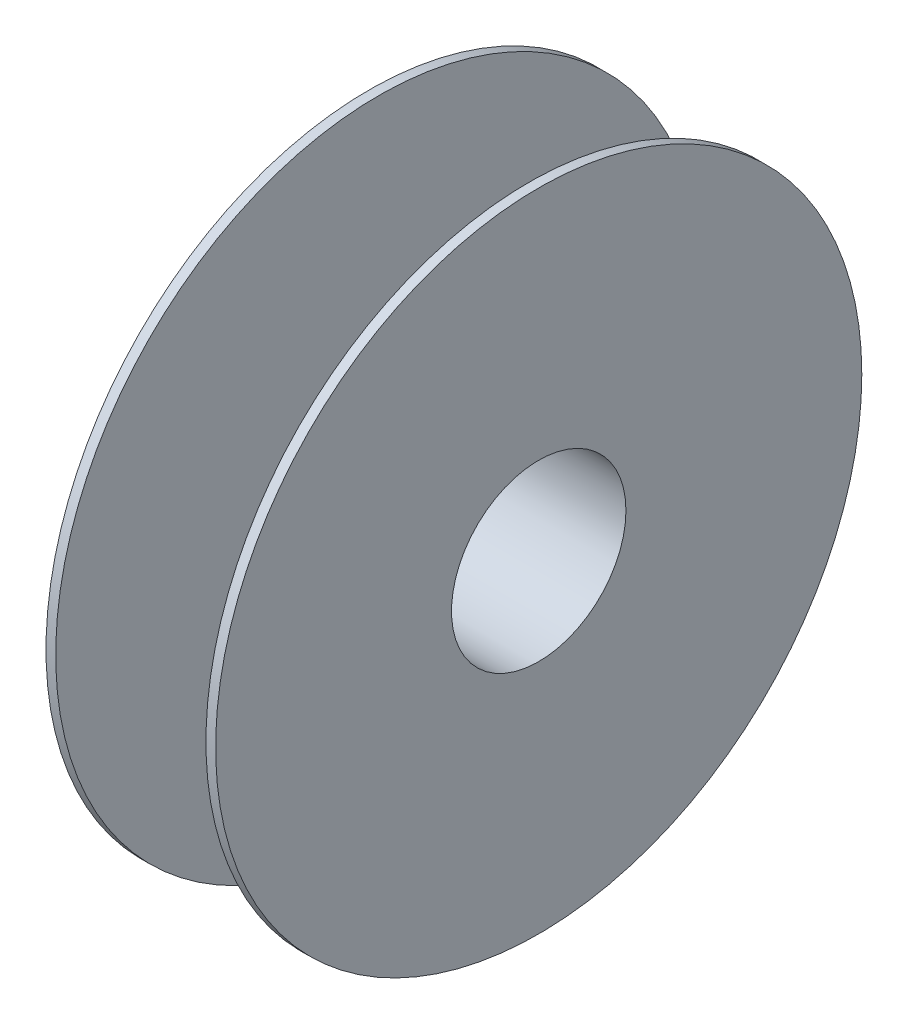
ISO-10303-21;
HEADER;
FILE_DESCRIPTION(('STEP AP214'),'2;1');
FILE_NAME('part.step','',(''),(''),'','','');
FILE_SCHEMA(('AUTOMOTIVE_DESIGN { 1 0 10303 214 1 1 1 1 }'));
ENDSEC;
DATA;
#1=APPLICATION_CONTEXT('core data for automotive mechanical design processes');
#2=APPLICATION_PROTOCOL_DEFINITION('international standard','automotive_design',2000,#1);
#3=PRODUCT_CONTEXT('',#1,'mechanical');
#4=PRODUCT('Part','Part','',(#3));
#5=PRODUCT_RELATED_PRODUCT_CATEGORY('part','',(#4));
#6=PRODUCT_DEFINITION_FORMATION('','',#4);
#7=PRODUCT_DEFINITION_CONTEXT('part definition',#1,'design');
#8=PRODUCT_DEFINITION('design','',#6,#7);
#9=PRODUCT_DEFINITION_SHAPE('','',#8);
#10=(LENGTH_UNIT() NAMED_UNIT(*) SI_UNIT(.MILLI.,.METRE.));
#11=(NAMED_UNIT(*) PLANE_ANGLE_UNIT() SI_UNIT($,.RADIAN.));
#12=(NAMED_UNIT(*) SI_UNIT($,.STERADIAN.) SOLID_ANGLE_UNIT());
#13=UNCERTAINTY_MEASURE_WITH_UNIT(LENGTH_MEASURE(1.E-05),#10,'distance_accuracy_value','');
#14=(GEOMETRIC_REPRESENTATION_CONTEXT(3) GLOBAL_UNCERTAINTY_ASSIGNED_CONTEXT((#13)) GLOBAL_UNIT_ASSIGNED_CONTEXT((#10,
#11,#12)) REPRESENTATION_CONTEXT('',''));
#15=CARTESIAN_POINT('',(0.,0.,0.));
#16=DIRECTION('',(0.,0.,1.));
#17=DIRECTION('',(1.,0.,0.));
#18=AXIS2_PLACEMENT_3D('',#15,#16,#17);
#19=CARTESIAN_POINT('',(0.,0.,0.));
#20=DIRECTION('',(1.,0.,0.));
#21=DIRECTION('',(0.,0.,-1.));
#22=AXIS2_PLACEMENT_3D('',#19,#20,#21);
#23=CYLINDRICAL_SURFACE('',#22,100.);
#24=CARTESIAN_POINT('',(-26.25,0.,0.));
#25=DIRECTION('',(1.,0.,0.));
#26=DIRECTION('',(0.,0.,-1.));
#27=AXIS2_PLACEMENT_3D('',#24,#25,#26);
#28=CIRCLE('',#27,100.);
#29=CARTESIAN_POINT('',(-26.25,0.,-100.));
#30=VERTEX_POINT('',#29);
#31=EDGE_CURVE('E75',#30,#30,#28,.T.);
#32=ORIENTED_EDGE('',*,*,#31,.T.);
#33=EDGE_LOOP('',(#32));
#34=FACE_BOUND('',#33,.T.);
#35=CARTESIAN_POINT('',(-23.25,0.,0.));
#36=DIRECTION('',(1.,0.,0.));
#37=DIRECTION('',(0.,0.,-1.));
#38=AXIS2_PLACEMENT_3D('',#35,#36,#37);
#39=CIRCLE('',#38,100.);
#40=CARTESIAN_POINT('',(-23.25,0.,-100.));
#41=VERTEX_POINT('',#40);
#42=EDGE_CURVE('E10',#41,#41,#39,.T.);
#43=ORIENTED_EDGE('',*,*,#42,.F.);
#44=EDGE_LOOP('',(#43));
#45=FACE_BOUND('',#44,.T.);
#46=ADVANCED_FACE('F40',(#34,#45),#23,.T.);
#47=CARTESIAN_POINT('',(-23.25,100.,0.));
#48=DIRECTION('',(1.,0.,0.));
#49=DIRECTION('',(0.,0.,-1.));
#50=AXIS2_PLACEMENT_3D('',#47,#48,#49);
#51=PLANE('',#50);
#52=ORIENTED_EDGE('',*,*,#42,.T.);
#53=EDGE_LOOP('',(#52));
#54=FACE_BOUND('',#53,.T.);
#55=CARTESIAN_POINT('',(-23.25,0.,0.));
#56=DIRECTION('',(1.,0.,0.));
#57=DIRECTION('',(0.,0.,-1.));
#58=AXIS2_PLACEMENT_3D('',#55,#56,#57);
#59=CIRCLE('',#58,30.);
#60=CARTESIAN_POINT('',(-23.25,0.,-30.));
#61=VERTEX_POINT('',#60);
#62=EDGE_CURVE('E47',#61,#61,#59,.T.);
#63=ORIENTED_EDGE('',*,*,#62,.F.);
#64=EDGE_LOOP('',(#63));
#65=FACE_BOUND('',#64,.T.);
#66=ADVANCED_FACE('F94',(#54,#65),#51,.T.);
#67=CARTESIAN_POINT('',(0.,0.,0.));
#68=DIRECTION('',(1.,0.,0.));
#69=DIRECTION('',(0.,0.,-1.));
#70=AXIS2_PLACEMENT_3D('',#67,#68,#69);
#71=CYLINDRICAL_SURFACE('',#70,30.);
#72=ORIENTED_EDGE('',*,*,#62,.T.);
#73=EDGE_LOOP('',(#72));
#74=FACE_BOUND('',#73,.T.);
#75=CARTESIAN_POINT('',(23.25,0.,0.));
#76=DIRECTION('',(1.,0.,0.));
#77=DIRECTION('',(0.,0.,-1.));
#78=AXIS2_PLACEMENT_3D('',#75,#76,#77);
#79=CIRCLE('',#78,30.);
#80=CARTESIAN_POINT('',(23.25,0.,-30.));
#81=VERTEX_POINT('',#80);
#82=EDGE_CURVE('E54',#81,#81,#79,.T.);
#83=ORIENTED_EDGE('',*,*,#82,.F.);
#84=EDGE_LOOP('',(#83));
#85=FACE_BOUND('',#84,.T.);
#86=ADVANCED_FACE('F98',(#74,#85),#71,.T.);
#87=CARTESIAN_POINT('',(23.25,30.,0.));
#88=DIRECTION('',(-1.,0.,0.));
#89=DIRECTION('',(0.,0.,1.));
#90=AXIS2_PLACEMENT_3D('',#87,#88,#89);
#91=PLANE('',#90);
#92=ORIENTED_EDGE('',*,*,#82,.T.);
#93=EDGE_LOOP('',(#92));
#94=FACE_BOUND('',#93,.T.);
#95=CARTESIAN_POINT('',(23.25,0.,0.));
#96=DIRECTION('',(1.,0.,0.));
#97=DIRECTION('',(0.,0.,-1.));
#98=AXIS2_PLACEMENT_3D('',#95,#96,#97);
#99=CIRCLE('',#98,100.);
#100=CARTESIAN_POINT('',(23.25,0.,-100.));
#101=VERTEX_POINT('',#100);
#102=EDGE_CURVE('E60',#101,#101,#99,.T.);
#103=ORIENTED_EDGE('',*,*,#102,.F.);
#104=EDGE_LOOP('',(#103));
#105=FACE_BOUND('',#104,.T.);
#106=ADVANCED_FACE('F102',(#94,#105),#91,.T.);
#107=CARTESIAN_POINT('',(0.,0.,0.));
#108=DIRECTION('',(1.,0.,0.));
#109=DIRECTION('',(0.,0.,-1.));
#110=AXIS2_PLACEMENT_3D('',#107,#108,#109);
#111=CYLINDRICAL_SURFACE('',#110,100.);
#112=ORIENTED_EDGE('',*,*,#102,.T.);
#113=EDGE_LOOP('',(#112));
#114=FACE_BOUND('',#113,.T.);
#115=CARTESIAN_POINT('',(26.25,0.,0.));
#116=DIRECTION('',(1.,0.,0.));
#117=DIRECTION('',(0.,0.,-1.));
#118=AXIS2_PLACEMENT_3D('',#115,#116,#117);
#119=CIRCLE('',#118,100.);
#120=CARTESIAN_POINT('',(26.25,0.,-100.));
#121=VERTEX_POINT('',#120);
#122=EDGE_CURVE('E65',#121,#121,#119,.T.);
#123=ORIENTED_EDGE('',*,*,#122,.F.);
#124=EDGE_LOOP('',(#123));
#125=FACE_BOUND('',#124,.T.);
#126=ADVANCED_FACE('F108',(#114,#125),#111,.T.);
#127=CARTESIAN_POINT('',(26.25,100.,0.));
#128=DIRECTION('',(1.,0.,0.));
#129=DIRECTION('',(0.,0.,-1.));
#130=AXIS2_PLACEMENT_3D('',#127,#128,#129);
#131=PLANE('',#130);
#132=ORIENTED_EDGE('',*,*,#122,.T.);
#133=EDGE_LOOP('',(#132));
#134=FACE_BOUND('',#133,.T.);
#135=CARTESIAN_POINT('',(26.25,0.,0.));
#136=DIRECTION('',(1.,0.,0.));
#137=DIRECTION('',(0.,0.,-1.));
#138=AXIS2_PLACEMENT_3D('',#135,#136,#137);
#139=CIRCLE('',#138,27.);
#140=CARTESIAN_POINT('',(26.25,0.,-27.));
#141=VERTEX_POINT('',#140);
#142=EDGE_CURVE('E68',#141,#141,#139,.T.);
#143=ORIENTED_EDGE('',*,*,#142,.F.);
#144=EDGE_LOOP('',(#143));
#145=FACE_BOUND('',#144,.T.);
#146=ADVANCED_FACE('F90',(#134,#145),#131,.T.);
#147=CARTESIAN_POINT('',(0.,0.,0.));
#148=DIRECTION('',(1.,0.,0.));
#149=DIRECTION('',(0.,0.,-1.));
#150=AXIS2_PLACEMENT_3D('',#147,#148,#149);
#151=CYLINDRICAL_SURFACE('',#150,27.);
#152=ORIENTED_EDGE('',*,*,#142,.T.);
#153=EDGE_LOOP('',(#152));
#154=FACE_BOUND('',#153,.T.);
#155=CARTESIAN_POINT('',(-26.25,0.,0.));
#156=DIRECTION('',(1.,0.,0.));
#157=DIRECTION('',(0.,0.,-1.));
#158=AXIS2_PLACEMENT_3D('',#155,#156,#157);
#159=CIRCLE('',#158,27.);
#160=CARTESIAN_POINT('',(-26.25,0.,-27.));
#161=VERTEX_POINT('',#160);
#162=EDGE_CURVE('E72',#161,#161,#159,.T.);
#163=ORIENTED_EDGE('',*,*,#162,.F.);
#164=EDGE_LOOP('',(#163));
#165=FACE_BOUND('',#164,.T.);
#166=ADVANCED_FACE('F84',(#154,#165),#151,.F.);
#167=CARTESIAN_POINT('',(-26.25,27.,0.));
#168=DIRECTION('',(-1.,0.,0.));
#169=DIRECTION('',(0.,0.,1.));
#170=AXIS2_PLACEMENT_3D('',#167,#168,#169);
#171=PLANE('',#170);
#172=ORIENTED_EDGE('',*,*,#162,.T.);
#173=EDGE_LOOP('',(#172));
#174=FACE_BOUND('',#173,.T.);
#175=ORIENTED_EDGE('',*,*,#31,.F.);
#176=EDGE_LOOP('',(#175));
#177=FACE_BOUND('',#176,.T.);
#178=ADVANCED_FACE('F82',(#174,#177),#171,.T.);
#179=CLOSED_SHELL('',(#46,#66,#86,#106,#126,#146,#166,#178));
#180=MANIFOLD_SOLID_BREP('B2',#179);
#181=ADVANCED_BREP_SHAPE_REPRESENTATION('',(#18,#180),#14);
#182=SHAPE_DEFINITION_REPRESENTATION(#9,#181);
ENDSEC;
END-ISO-10303-21;
